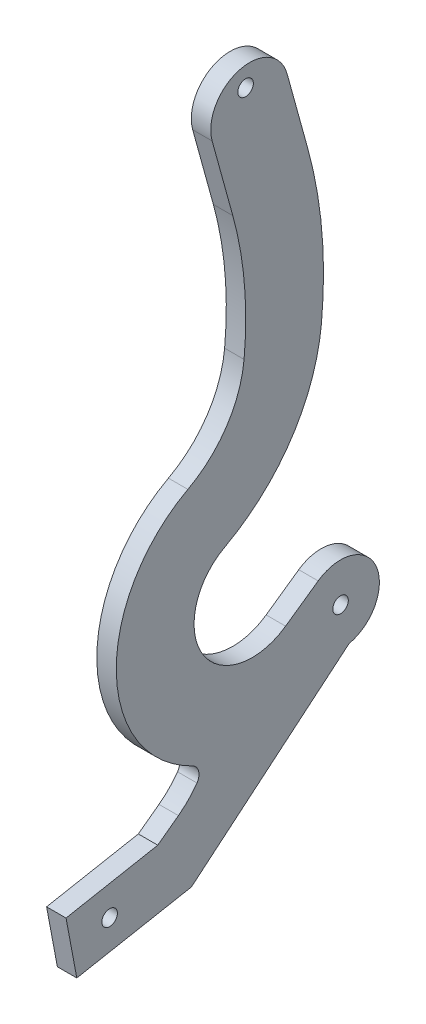
ISO-10303-21;
HEADER;
FILE_DESCRIPTION(('STEP AP214'),'2;1');
FILE_NAME('part.step','',(''),(''),'','','');
FILE_SCHEMA(('AUTOMOTIVE_DESIGN { 1 0 10303 214 1 1 1 1 }'));
ENDSEC;
DATA;
#1=APPLICATION_CONTEXT('core data for automotive mechanical design processes');
#2=APPLICATION_PROTOCOL_DEFINITION('international standard','automotive_design',2000,#1);
#3=PRODUCT_CONTEXT('',#1,'mechanical');
#4=PRODUCT('Part','Part','',(#3));
#5=PRODUCT_RELATED_PRODUCT_CATEGORY('part','',(#4));
#6=PRODUCT_DEFINITION_FORMATION('','',#4);
#7=PRODUCT_DEFINITION_CONTEXT('part definition',#1,'design');
#8=PRODUCT_DEFINITION('design','',#6,#7);
#9=PRODUCT_DEFINITION_SHAPE('','',#8);
#10=(LENGTH_UNIT() NAMED_UNIT(*) SI_UNIT(.MILLI.,.METRE.));
#11=(NAMED_UNIT(*) PLANE_ANGLE_UNIT() SI_UNIT($,.RADIAN.));
#12=(NAMED_UNIT(*) SI_UNIT($,.STERADIAN.) SOLID_ANGLE_UNIT());
#13=UNCERTAINTY_MEASURE_WITH_UNIT(LENGTH_MEASURE(1.E-05),#10,'distance_accuracy_value','');
#14=(GEOMETRIC_REPRESENTATION_CONTEXT(3) GLOBAL_UNCERTAINTY_ASSIGNED_CONTEXT((#13)) GLOBAL_UNIT_ASSIGNED_CONTEXT((#10,
#11,#12)) REPRESENTATION_CONTEXT('',''));
#15=CARTESIAN_POINT('',(0.,0.,0.));
#16=DIRECTION('',(0.,0.,1.));
#17=DIRECTION('',(1.,0.,0.));
#18=AXIS2_PLACEMENT_3D('',#15,#16,#17);
#19=CARTESIAN_POINT('',(6.35,155.517192161782,29.6872873156875));
#20=DIRECTION('',(-1.,0.,0.));
#21=DIRECTION('',(0.,0.,1.));
#22=AXIS2_PLACEMENT_3D('',#19,#20,#21);
#23=PLANE('',#22);
#24=CARTESIAN_POINT('',(6.35,161.740192161782,31.0071189591956));
#25=DIRECTION('',(1.,0.,0.));
#26=DIRECTION('',(0.,0.,-1.));
#27=AXIS2_PLACEMENT_3D('',#24,#25,#26);
#28=CIRCLE('',#27,2.54000000000002);
#29=CARTESIAN_POINT('',(6.35,161.740192161782,28.4671189591955));
#30=VERTEX_POINT('',#29);
#31=EDGE_CURVE('E51',#30,#30,#28,.T.);
#32=ORIENTED_EDGE('',*,*,#31,.F.);
#33=EDGE_LOOP('',(#32));
#34=FACE_BOUND('',#33,.T.);
#35=CARTESIAN_POINT('',(6.35,96.4492040395704,148.413015743073));
#36=DIRECTION('',(-1.,0.,0.));
#37=DIRECTION('',(0.,0.,1.));
#38=AXIS2_PLACEMENT_3D('',#35,#36,#37);
#39=CIRCLE('',#38,117.452471399576);
#40=CARTESIAN_POINT('',(6.35,127.65581082175,35.1821421660723));
#41=VERTEX_POINT('',#40);
#42=CARTESIAN_POINT('',(6.35,85.1485598709771,31.5054519191565));
#43=VERTEX_POINT('',#42);
#44=EDGE_CURVE('E94',#41,#43,#39,.T.);
#45=ORIENTED_EDGE('',*,*,#44,.T.);
#46=CARTESIAN_POINT('',(6.35,88.5305289737302,66.4926405105344));
#47=DIRECTION('',(1.,0.,0.));
#48=DIRECTION('',(0.,0.,-1.));
#49=AXIS2_PLACEMENT_3D('',#46,#47,#48);
#50=CIRCLE('',#49,35.1502643025713);
#51=CARTESIAN_POINT('',(6.35,57.5648593461637,49.8592889223241));
#52=VERTEX_POINT('',#51);
#53=EDGE_CURVE('E108',#52,#43,#50,.T.);
#54=ORIENTED_EDGE('',*,*,#53,.F.);
#55=CARTESIAN_POINT('',(6.35,18.4598877016455,28.8538738922794));
#56=DIRECTION('',(1.,0.,0.));
#57=DIRECTION('',(0.,0.,-1.));
#58=AXIS2_PLACEMENT_3D('',#55,#56,#57);
#59=CIRCLE('',#58,44.3894837535085);
#60=CARTESIAN_POINT('',(6.35,-21.574793953466,48.0280892002617));
#61=VERTEX_POINT('',#60);
#62=EDGE_CURVE('E122',#52,#61,#59,.T.);
#63=ORIENTED_EDGE('',*,*,#62,.T.);
#64=CARTESIAN_POINT('',(6.35,-24.8697292453495,50.1607095545222));
#65=DIRECTION('',(1.,0.,0.));
#66=DIRECTION('',(0.,0.,-1.));
#67=AXIS2_PLACEMENT_3D('',#64,#65,#66);
#68=CIRCLE('',#67,3.92487810678309);
#69=CARTESIAN_POINT('',(6.35,-27.00234959961,46.8657742626387));
#70=VERTEX_POINT('',#69);
#71=EDGE_CURVE('E127',#61,#70,#68,.F.);
#72=ORIENTED_EDGE('',*,*,#71,.T.);
#73=CARTESIAN_POINT('',(6.35,-10.6975357372604,69.5549048082134));
#74=DIRECTION('',(-1.,0.,0.));
#75=DIRECTION('',(0.,0.,1.));
#76=AXIS2_PLACEMENT_3D('',#73,#74,#75);
#77=CIRCLE('',#76,27.94);
#78=CARTESIAN_POINT('',(6.35,-33.1640370208868,52.9446694073285));
#79=VERTEX_POINT('',#78);
#80=EDGE_CURVE('E329',#70,#79,#77,.T.);
#81=ORIENTED_EDGE('',*,*,#80,.T.);
#82=DIRECTION('',(0.,-0.594496614204901,0.804098113229293));
#83=VECTOR('',#82,1.);
#84=CARTESIAN_POINT('',(6.35,-33.1640370208868,52.9446694073285));
#85=LINE('',#84,#83);
#86=CARTESIAN_POINT('',(6.35,-38.1558400001423,59.6964309166854));
#87=VERTEX_POINT('',#86);
#88=EDGE_CURVE('E357',#79,#87,#85,.T.);
#89=ORIENTED_EDGE('',*,*,#88,.T.);
#90=DIRECTION('',(0.,-0.184641972003783,0.982805851719735));
#91=VECTOR('',#90,1.);
#92=CARTESIAN_POINT('',(6.35,-38.1558400001423,59.6964309166854));
#93=LINE('',#92,#91);
#94=CARTESIAN_POINT('',(6.35,-43.7837273068176,89.652353277103));
#95=VERTEX_POINT('',#94);
#96=EDGE_CURVE('E361',#87,#95,#93,.T.);
#97=ORIENTED_EDGE('',*,*,#96,.T.);
#98=DIRECTION('',(0.,-0.982805851719735,-0.184641972003782));
#99=VECTOR('',#98,1.);
#100=CARTESIAN_POINT('',(6.35,-43.7837273068176,89.652353277103));
#101=LINE('',#100,#99);
#102=CARTESIAN_POINT('',(6.35,-62.5061787820785,86.1349237104309));
#103=VERTEX_POINT('',#102);
#104=EDGE_CURVE('E365',#95,#103,#101,.T.);
#105=ORIENTED_EDGE('',*,*,#104,.T.);
#106=DIRECTION('',(0.,0.184641972003782,-0.982805851719735));
#107=VECTOR('',#106,1.);
#108=CARTESIAN_POINT('',(6.35,-62.5061787820785,86.1349237104309));
#109=LINE('',#108,#107);
#110=CARTESIAN_POINT('',(6.35,-55.4713196487344,48.690020759909));
#111=VERTEX_POINT('',#110);
#112=EDGE_CURVE('E337',#103,#111,#109,.T.);
#113=ORIENTED_EDGE('',*,*,#112,.T.);
#114=DIRECTION('',(0.,0.641903083129622,-0.766785779646888));
#115=VECTOR('',#114,1.);
#116=CARTESIAN_POINT('',(6.35,-8.64960786059183,-7.24088800412151));
#117=LINE('',#116,#115);
#118=CARTESIAN_POINT('',(6.35,-12.3949253178535,-2.76691640004438));
#119=VERTEX_POINT('',#118);
#120=EDGE_CURVE('E137',#111,#119,#117,.T.);
#121=ORIENTED_EDGE('',*,*,#120,.T.);
#122=CARTESIAN_POINT('',(6.35,0.,0.));
#123=DIRECTION('',(1.,0.,0.));
#124=DIRECTION('',(0.,0.,-1.));
#125=AXIS2_PLACEMENT_3D('',#122,#123,#124);
#126=CIRCLE('',#125,12.7);
#127=CARTESIAN_POINT('',(6.35,10.3930835891263,7.29889125206247));
#128=VERTEX_POINT('',#127);
#129=EDGE_CURVE('E141',#119,#128,#126,.T.);
#130=ORIENTED_EDGE('',*,*,#129,.T.);
#131=DIRECTION('',(0.,0.574715846619092,-0.81835303851388));
#132=VECTOR('',#131,1.);
#133=CARTESIAN_POINT('',(6.35,10.3930835891263,7.29889125206247));
#134=LINE('',#133,#132);
#135=CARTESIAN_POINT('',(6.35,2.9197859721519,17.9403166600223));
#136=VERTEX_POINT('',#135);
#137=EDGE_CURVE('E145',#136,#128,#134,.T.);
#138=ORIENTED_EDGE('',*,*,#137,.F.);
#139=CARTESIAN_POINT('',(6.35,18.4598877016455,28.8538738922794));
#140=DIRECTION('',(1.,0.,0.));
#141=DIRECTION('',(0.,0.,-1.));
#142=AXIS2_PLACEMENT_3D('',#139,#140,#141);
#143=CIRCLE('',#142,18.9894837535085);
#144=CARTESIAN_POINT('',(6.35,35.1886973415255,37.8398307838643));
#145=VERTEX_POINT('',#144);
#146=EDGE_CURVE('E130',#145,#136,#143,.T.);
#147=ORIENTED_EDGE('',*,*,#146,.F.);
#148=CARTESIAN_POINT('',(6.35,88.5305289737426,66.4926405105415));
#149=DIRECTION('',(1.,0.,0.));
#150=DIRECTION('',(0.,0.,-1.));
#151=AXIS2_PLACEMENT_3D('',#148,#149,#150);
#152=CIRCLE('',#151,60.5502643025855);
#153=CARTESIAN_POINT('',(6.35,82.7047086820081,6.22329237202771));
#154=VERTEX_POINT('',#153);
#155=EDGE_CURVE('E123',#145,#154,#152,.T.);
#156=ORIENTED_EDGE('',*,*,#155,.T.);
#157=CARTESIAN_POINT('',(6.35,96.4492040395463,148.41301574316));
#158=DIRECTION('',(1.,0.,0.));
#159=DIRECTION('',(0.,0.,1.));
#160=AXIS2_PLACEMENT_3D('',#157,#158,#159);
#161=CIRCLE('',#160,142.852471399667);
#162=CARTESIAN_POINT('',(6.35,134.404479477437,10.6950951539122));
#163=VERTEX_POINT('',#162);
#164=EDGE_CURVE('E114',#154,#163,#161,.T.);
#165=ORIENTED_EDGE('',*,*,#164,.T.);
#166=DIRECTION('',(0.,0.964056968982683,0.26569561636565));
#167=VECTOR('',#166,1.);
#168=CARTESIAN_POINT('',(6.35,158.891526489625,17.4437638096074));
#169=LINE('',#168,#167);
#170=CARTESIAN_POINT('',(6.35,158.891526489625,17.4437638096074));
#171=VERTEX_POINT('',#170);
#172=EDGE_CURVE('E210',#163,#171,#169,.T.);
#173=ORIENTED_EDGE('',*,*,#172,.T.);
#174=CARTESIAN_POINT('',(6.35,155.517192161782,29.6872873156875));
#175=DIRECTION('',(1.,0.,0.));
#176=DIRECTION('',(0.,0.,1.));
#177=AXIS2_PLACEMENT_3D('',#174,#175,#176);
#178=CIRCLE('',#177,12.7);
#179=CARTESIAN_POINT('',(6.35,152.142857833938,41.9308108217675));
#180=VERTEX_POINT('',#179);
#181=EDGE_CURVE('E213',#171,#180,#178,.T.);
#182=ORIENTED_EDGE('',*,*,#181,.T.);
#183=DIRECTION('',(0.,-0.964056968982683,-0.265695616365649));
#184=VECTOR('',#183,1.);
#185=CARTESIAN_POINT('',(6.35,139.899334327844,38.5564764939199));
#186=LINE('',#185,#184);
#187=EDGE_CURVE('E111',#180,#41,#186,.T.);
#188=ORIENTED_EDGE('',*,*,#187,.T.);
#189=EDGE_LOOP('',(#45,#54,#63,#72,#81,#89,#97,#105,#113,#121,#130,#138,#147,#156,#165,#173,
#182,#188));
#190=FACE_BOUND('',#189,.T.);
#191=CARTESIAN_POINT('',(6.35,0.,0.));
#192=DIRECTION('',(1.,0.,0.));
#193=DIRECTION('',(0.,0.,-1.));
#194=AXIS2_PLACEMENT_3D('',#191,#192,#193);
#195=CIRCLE('',#194,2.54);
#196=CARTESIAN_POINT('',(6.35,0.,-2.54));
#197=VERTEX_POINT('',#196);
#198=EDGE_CURVE('E149',#197,#197,#195,.F.);
#199=ORIENTED_EDGE('',*,*,#198,.T.);
#200=EDGE_LOOP('',(#199));
#201=FACE_BOUND('',#200,.T.);
#202=CARTESIAN_POINT('',(6.35,-50.8,75.4120041769263));
#203=DIRECTION('',(1.,0.,0.));
#204=DIRECTION('',(0.,0.,-1.));
#205=AXIS2_PLACEMENT_3D('',#202,#203,#204);
#206=CIRCLE('',#205,2.54);
#207=CARTESIAN_POINT('',(6.35,-50.8,72.8720041769263));
#208=VERTEX_POINT('',#207);
#209=EDGE_CURVE('E324',#208,#208,#206,.T.);
#210=ORIENTED_EDGE('',*,*,#209,.F.);
#211=EDGE_LOOP('',(#210));
#212=FACE_BOUND('',#211,.T.);
#213=ADVANCED_FACE('F41',(#34,#190,#201,#212),#23,.F.);
#214=CARTESIAN_POINT('',(0.,155.517192161782,29.6872873156875));
#215=DIRECTION('',(-1.,0.,0.));
#216=DIRECTION('',(0.,0.,1.));
#217=AXIS2_PLACEMENT_3D('',#214,#215,#216);
#218=PLANE('',#217);
#219=CARTESIAN_POINT('',(0.,96.4492040395463,148.41301574316));
#220=DIRECTION('',(1.,0.,0.));
#221=DIRECTION('',(0.,0.,1.));
#222=AXIS2_PLACEMENT_3D('',#219,#220,#221);
#223=CIRCLE('',#222,142.852471399667);
#224=CARTESIAN_POINT('',(0.,82.704708682008,6.22329237202771));
#225=VERTEX_POINT('',#224);
#226=CARTESIAN_POINT('',(0.,134.404479477437,10.6950951539122));
#227=VERTEX_POINT('',#226);
#228=EDGE_CURVE('E187',#225,#227,#223,.T.);
#229=ORIENTED_EDGE('',*,*,#228,.F.);
#230=CARTESIAN_POINT('',(0.,88.5305289737426,66.4926405105415));
#231=DIRECTION('',(1.,0.,0.));
#232=DIRECTION('',(0.,0.,-1.));
#233=AXIS2_PLACEMENT_3D('',#230,#231,#232);
#234=CIRCLE('',#233,60.5502643025855);
#235=CARTESIAN_POINT('',(0.,35.1886973415255,37.8398307838643));
#236=VERTEX_POINT('',#235);
#237=EDGE_CURVE('E394',#236,#225,#234,.T.);
#238=ORIENTED_EDGE('',*,*,#237,.F.);
#239=CARTESIAN_POINT('',(0.,18.4598877016455,28.8538738922794));
#240=DIRECTION('',(1.,0.,0.));
#241=DIRECTION('',(0.,0.,-1.));
#242=AXIS2_PLACEMENT_3D('',#239,#240,#241);
#243=CIRCLE('',#242,18.9894837535085);
#244=CARTESIAN_POINT('',(0.,2.9197859721519,17.9403166600223));
#245=VERTEX_POINT('',#244);
#246=EDGE_CURVE('E153',#236,#245,#243,.T.);
#247=ORIENTED_EDGE('',*,*,#246,.T.);
#248=DIRECTION('',(0.,0.574715846619092,-0.81835303851388));
#249=VECTOR('',#248,1.);
#250=CARTESIAN_POINT('',(0.,10.3930835891263,7.29889125206247));
#251=LINE('',#250,#249);
#252=CARTESIAN_POINT('',(0.,10.3930835891263,7.29889125206247));
#253=VERTEX_POINT('',#252);
#254=EDGE_CURVE('E417',#245,#253,#251,.T.);
#255=ORIENTED_EDGE('',*,*,#254,.T.);
#256=CARTESIAN_POINT('',(0.,0.,0.));
#257=DIRECTION('',(1.,0.,0.));
#258=DIRECTION('',(0.,0.,-1.));
#259=AXIS2_PLACEMENT_3D('',#256,#257,#258);
#260=CIRCLE('',#259,12.7);
#261=CARTESIAN_POINT('',(0.,-12.3949253178535,-2.76691640004438));
#262=VERTEX_POINT('',#261);
#263=EDGE_CURVE('E413',#262,#253,#260,.T.);
#264=ORIENTED_EDGE('',*,*,#263,.F.);
#265=DIRECTION('',(0.,0.641903083129622,-0.766785779646888));
#266=VECTOR('',#265,1.);
#267=CARTESIAN_POINT('',(0.,-8.64960786059183,-7.24088800412151));
#268=LINE('',#267,#266);
#269=CARTESIAN_POINT('',(0.,-55.4713196487344,48.690020759909));
#270=VERTEX_POINT('',#269);
#271=EDGE_CURVE('E409',#270,#262,#268,.T.);
#272=ORIENTED_EDGE('',*,*,#271,.F.);
#273=DIRECTION('',(0.,0.184641972003782,-0.982805851719735));
#274=VECTOR('',#273,1.);
#275=CARTESIAN_POINT('',(0.,-62.5061787820785,86.1349237104309));
#276=LINE('',#275,#274);
#277=CARTESIAN_POINT('',(0.,-62.5061787820785,86.1349237104309));
#278=VERTEX_POINT('',#277);
#279=EDGE_CURVE('E349',#278,#270,#276,.T.);
#280=ORIENTED_EDGE('',*,*,#279,.F.);
#281=DIRECTION('',(0.,-0.982805851719735,-0.184641972003782));
#282=VECTOR('',#281,1.);
#283=CARTESIAN_POINT('',(0.,-43.7837273068176,89.652353277103));
#284=LINE('',#283,#282);
#285=CARTESIAN_POINT('',(0.,-43.7837273068176,89.652353277103));
#286=VERTEX_POINT('',#285);
#287=EDGE_CURVE('E345',#286,#278,#284,.T.);
#288=ORIENTED_EDGE('',*,*,#287,.F.);
#289=DIRECTION('',(0.,-0.184641972003783,0.982805851719735));
#290=VECTOR('',#289,1.);
#291=CARTESIAN_POINT('',(0.,-38.1558400001423,59.6964309166854));
#292=LINE('',#291,#290);
#293=CARTESIAN_POINT('',(0.,-38.1558400001423,59.6964309166854));
#294=VERTEX_POINT('',#293);
#295=EDGE_CURVE('E341',#294,#286,#292,.T.);
#296=ORIENTED_EDGE('',*,*,#295,.F.);
#297=DIRECTION('',(0.,-0.594496614204901,0.804098113229293));
#298=VECTOR('',#297,1.);
#299=CARTESIAN_POINT('',(0.,-33.1640370208868,52.9446694073285));
#300=LINE('',#299,#298);
#301=CARTESIAN_POINT('',(0.,-33.1640370208868,52.9446694073285));
#302=VERTEX_POINT('',#301);
#303=EDGE_CURVE('E336',#302,#294,#300,.T.);
#304=ORIENTED_EDGE('',*,*,#303,.F.);
#305=CARTESIAN_POINT('',(0.,-10.6975357372604,69.5549048082134));
#306=DIRECTION('',(-1.,0.,0.));
#307=DIRECTION('',(0.,0.,1.));
#308=AXIS2_PLACEMENT_3D('',#305,#306,#307);
#309=CIRCLE('',#308,27.94);
#310=CARTESIAN_POINT('',(0.,-27.00234959961,46.8657742626387));
#311=VERTEX_POINT('',#310);
#312=EDGE_CURVE('E332',#311,#302,#309,.T.);
#313=ORIENTED_EDGE('',*,*,#312,.F.);
#314=CARTESIAN_POINT('',(0.,-24.8697292453495,50.1607095545222));
#315=DIRECTION('',(1.,0.,0.));
#316=DIRECTION('',(0.,0.,-1.));
#317=AXIS2_PLACEMENT_3D('',#314,#315,#316);
#318=CIRCLE('',#317,3.92487810678309);
#319=CARTESIAN_POINT('',(0.,-21.574793953466,48.0280892002617));
#320=VERTEX_POINT('',#319);
#321=EDGE_CURVE('E405',#320,#311,#318,.F.);
#322=ORIENTED_EDGE('',*,*,#321,.F.);
#323=CARTESIAN_POINT('',(0.,18.4598877016455,28.8538738922794));
#324=DIRECTION('',(1.,0.,0.));
#325=DIRECTION('',(0.,0.,-1.));
#326=AXIS2_PLACEMENT_3D('',#323,#324,#325);
#327=CIRCLE('',#326,44.3894837535085);
#328=CARTESIAN_POINT('',(0.,57.5648593461637,49.8592889223241));
#329=VERTEX_POINT('',#328);
#330=EDGE_CURVE('E401',#329,#320,#327,.T.);
#331=ORIENTED_EDGE('',*,*,#330,.F.);
#332=CARTESIAN_POINT('',(0.,88.5305289737302,66.4926405105344));
#333=DIRECTION('',(1.,0.,0.));
#334=DIRECTION('',(0.,0.,-1.));
#335=AXIS2_PLACEMENT_3D('',#332,#333,#334);
#336=CIRCLE('',#335,35.1502643025713);
#337=CARTESIAN_POINT('',(0.,85.1485598709771,31.5054519191565));
#338=VERTEX_POINT('',#337);
#339=EDGE_CURVE('E398',#329,#338,#336,.T.);
#340=ORIENTED_EDGE('',*,*,#339,.T.);
#341=CARTESIAN_POINT('',(0.,96.4492040395704,148.413015743073));
#342=DIRECTION('',(-1.,0.,0.));
#343=DIRECTION('',(0.,0.,1.));
#344=AXIS2_PLACEMENT_3D('',#341,#342,#343);
#345=CIRCLE('',#344,117.452471399576);
#346=CARTESIAN_POINT('',(0.,127.65581082175,35.1821421660723));
#347=VERTEX_POINT('',#346);
#348=EDGE_CURVE('E96',#347,#338,#345,.T.);
#349=ORIENTED_EDGE('',*,*,#348,.F.);
#350=DIRECTION('',(0.,-0.964056968982683,-0.265695616365648));
#351=VECTOR('',#350,1.);
#352=CARTESIAN_POINT('',(0.,139.899334327844,38.5564764939199));
#353=LINE('',#352,#351);
#354=CARTESIAN_POINT('',(0.,152.142857833938,41.9308108217675));
#355=VERTEX_POINT('',#354);
#356=EDGE_CURVE('E184',#355,#347,#353,.T.);
#357=ORIENTED_EDGE('',*,*,#356,.F.);
#358=CARTESIAN_POINT('',(0.,155.517192161782,29.6872873156875));
#359=DIRECTION('',(1.,0.,0.));
#360=DIRECTION('',(0.,0.,1.));
#361=AXIS2_PLACEMENT_3D('',#358,#359,#360);
#362=CIRCLE('',#361,12.7);
#363=CARTESIAN_POINT('',(0.,158.891526489625,17.4437638096074));
#364=VERTEX_POINT('',#363);
#365=EDGE_CURVE('E197',#364,#355,#362,.T.);
#366=ORIENTED_EDGE('',*,*,#365,.F.);
#367=DIRECTION('',(0.,0.964056968982683,0.26569561636565));
#368=VECTOR('',#367,1.);
#369=CARTESIAN_POINT('',(0.,158.891526489625,17.4437638096074));
#370=LINE('',#369,#368);
#371=EDGE_CURVE('E192',#227,#364,#370,.T.);
#372=ORIENTED_EDGE('',*,*,#371,.F.);
#373=EDGE_LOOP('',(#229,#238,#247,#255,#264,#272,#280,#288,#296,#304,#313,#322,#331,#340,#349,
#357,#366,#372));
#374=FACE_BOUND('',#373,.T.);
#375=CARTESIAN_POINT('',(0.,161.740192161782,31.0071189591956));
#376=DIRECTION('',(1.,0.,0.));
#377=DIRECTION('',(0.,0.,-1.));
#378=AXIS2_PLACEMENT_3D('',#375,#376,#377);
#379=CIRCLE('',#378,2.54000000000002);
#380=CARTESIAN_POINT('',(0.,161.740192161782,28.4671189591955));
#381=VERTEX_POINT('',#380);
#382=EDGE_CURVE('E209',#381,#381,#379,.T.);
#383=ORIENTED_EDGE('',*,*,#382,.T.);
#384=EDGE_LOOP('',(#383));
#385=FACE_BOUND('',#384,.T.);
#386=CARTESIAN_POINT('',(0.,0.,0.));
#387=DIRECTION('',(1.,0.,0.));
#388=DIRECTION('',(0.,0.,-1.));
#389=AXIS2_PLACEMENT_3D('',#386,#387,#388);
#390=CIRCLE('',#389,2.54);
#391=CARTESIAN_POINT('',(0.,0.,-2.54));
#392=VERTEX_POINT('',#391);
#393=EDGE_CURVE('E179',#392,#392,#390,.F.);
#394=ORIENTED_EDGE('',*,*,#393,.F.);
#395=EDGE_LOOP('',(#394));
#396=FACE_BOUND('',#395,.T.);
#397=CARTESIAN_POINT('',(0.,-50.8,75.4120041769263));
#398=DIRECTION('',(1.,0.,0.));
#399=DIRECTION('',(0.,0.,-1.));
#400=AXIS2_PLACEMENT_3D('',#397,#398,#399);
#401=CIRCLE('',#400,2.54);
#402=CARTESIAN_POINT('',(0.,-50.8,72.8720041769263));
#403=VERTEX_POINT('',#402);
#404=EDGE_CURVE('E321',#403,#403,#401,.T.);
#405=ORIENTED_EDGE('',*,*,#404,.T.);
#406=EDGE_LOOP('',(#405));
#407=FACE_BOUND('',#406,.T.);
#408=ADVANCED_FACE('F231',(#374,#385,#396,#407),#218,.T.);
#409=CARTESIAN_POINT('',(6.35,155.517192161782,29.6872873156875));
#410=DIRECTION('',(-1.,0.,0.));
#411=DIRECTION('',(0.,0.,1.));
#412=AXIS2_PLACEMENT_3D('',#409,#410,#411);
#413=CYLINDRICAL_SURFACE('',#412,12.7);
#414=ORIENTED_EDGE('',*,*,#365,.T.);
#415=DIRECTION('',(-1.,0.,0.));
#416=VECTOR('',#415,1.);
#417=CARTESIAN_POINT('',(6.35,152.142857833938,41.9308108217675));
#418=LINE('',#417,#416);
#419=EDGE_CURVE('E180',#180,#355,#418,.T.);
#420=ORIENTED_EDGE('',*,*,#419,.F.);
#421=ORIENTED_EDGE('',*,*,#181,.F.);
#422=DIRECTION('',(-1.,0.,0.));
#423=VECTOR('',#422,1.);
#424=CARTESIAN_POINT('',(6.35,158.891526489625,17.4437638096074));
#425=LINE('',#424,#423);
#426=EDGE_CURVE('E193',#171,#364,#425,.T.);
#427=ORIENTED_EDGE('',*,*,#426,.T.);
#428=EDGE_LOOP('',(#414,#420,#421,#427));
#429=FACE_BOUND('',#428,.T.);
#430=ADVANCED_FACE('F235',(#429),#413,.T.);
#431=CARTESIAN_POINT('',(6.35,139.899334327844,38.5564764939199));
#432=DIRECTION('',(0.,0.265695616365648,-0.964056968982683));
#433=DIRECTION('',(0.,0.964056968982683,0.265695616365648));
#434=AXIS2_PLACEMENT_3D('',#431,#432,#433);
#435=PLANE('',#434);
#436=ORIENTED_EDGE('',*,*,#356,.T.);
#437=DIRECTION('',(-1.,0.,0.));
#438=VECTOR('',#437,1.);
#439=CARTESIAN_POINT('',(6.35,127.65581082175,35.1821421660723));
#440=LINE('',#439,#438);
#441=EDGE_CURVE('E102',#41,#347,#440,.T.);
#442=ORIENTED_EDGE('',*,*,#441,.F.);
#443=ORIENTED_EDGE('',*,*,#187,.F.);
#444=ORIENTED_EDGE('',*,*,#419,.T.);
#445=EDGE_LOOP('',(#436,#442,#443,#444));
#446=FACE_BOUND('',#445,.T.);
#447=ADVANCED_FACE('F240',(#446),#435,.F.);
#448=CARTESIAN_POINT('',(6.35,96.4492040395704,148.413015743073));
#449=DIRECTION('',(-1.,0.,0.));
#450=DIRECTION('',(0.,0.,1.));
#451=AXIS2_PLACEMENT_3D('',#448,#449,#450);
#452=CYLINDRICAL_SURFACE('',#451,117.452471399576);
#453=ORIENTED_EDGE('',*,*,#348,.T.);
#454=DIRECTION('',(1.,0.,0.));
#455=VECTOR('',#454,1.);
#456=CARTESIAN_POINT('',(0.,85.1485598709771,31.5054519191565));
#457=LINE('',#456,#455);
#458=EDGE_CURVE('E44',#338,#43,#457,.T.);
#459=ORIENTED_EDGE('',*,*,#458,.T.);
#460=ORIENTED_EDGE('',*,*,#44,.F.);
#461=ORIENTED_EDGE('',*,*,#441,.T.);
#462=EDGE_LOOP('',(#453,#459,#460,#461));
#463=FACE_BOUND('',#462,.T.);
#464=ADVANCED_FACE('F92',(#463),#452,.F.);
#465=CARTESIAN_POINT('',(6.35,96.4492040395463,148.41301574316));
#466=DIRECTION('',(-1.,0.,0.));
#467=DIRECTION('',(0.,0.,1.));
#468=AXIS2_PLACEMENT_3D('',#465,#466,#467);
#469=CYLINDRICAL_SURFACE('',#468,142.852471399667);
#470=ORIENTED_EDGE('',*,*,#164,.F.);
#471=DIRECTION('',(1.,0.,0.));
#472=VECTOR('',#471,1.);
#473=CARTESIAN_POINT('',(0.,82.704708682008,6.22329237202771));
#474=LINE('',#473,#472);
#475=EDGE_CURVE('E11',#225,#154,#474,.T.);
#476=ORIENTED_EDGE('',*,*,#475,.F.);
#477=ORIENTED_EDGE('',*,*,#228,.T.);
#478=DIRECTION('',(-1.,0.,0.));
#479=VECTOR('',#478,1.);
#480=CARTESIAN_POINT('',(6.35,134.404479477437,10.6950951539122));
#481=LINE('',#480,#479);
#482=EDGE_CURVE('E188',#163,#227,#481,.T.);
#483=ORIENTED_EDGE('',*,*,#482,.F.);
#484=EDGE_LOOP('',(#470,#476,#477,#483));
#485=FACE_BOUND('',#484,.T.);
#486=ADVANCED_FACE('F251',(#485),#469,.T.);
#487=CARTESIAN_POINT('',(6.35,158.891526489625,17.4437638096074));
#488=DIRECTION('',(0.,-0.26569561636565,0.964056968982683));
#489=DIRECTION('',(0.,-0.964056968982683,-0.26569561636565));
#490=AXIS2_PLACEMENT_3D('',#487,#488,#489);
#491=PLANE('',#490);
#492=ORIENTED_EDGE('',*,*,#371,.T.);
#493=ORIENTED_EDGE('',*,*,#426,.F.);
#494=ORIENTED_EDGE('',*,*,#172,.F.);
#495=ORIENTED_EDGE('',*,*,#482,.T.);
#496=EDGE_LOOP('',(#492,#493,#494,#495));
#497=FACE_BOUND('',#496,.T.);
#498=ADVANCED_FACE('F248',(#497),#491,.F.);
#499=CARTESIAN_POINT('',(6.35,161.740192161782,31.0071189591956));
#500=DIRECTION('',(-1.,0.,0.));
#501=DIRECTION('',(0.,0.,1.));
#502=AXIS2_PLACEMENT_3D('',#499,#500,#501);
#503=CYLINDRICAL_SURFACE('',#502,2.54000000000002);
#504=ORIENTED_EDGE('',*,*,#31,.T.);
#505=EDGE_LOOP('',(#504));
#506=FACE_BOUND('',#505,.T.);
#507=ORIENTED_EDGE('',*,*,#382,.F.);
#508=EDGE_LOOP('',(#507));
#509=FACE_BOUND('',#508,.T.);
#510=ADVANCED_FACE('F227',(#506,#509),#503,.F.);
#511=CARTESIAN_POINT('',(0.,18.4598877016455,28.8538738922794));
#512=DIRECTION('',(1.,0.,0.));
#513=DIRECTION('',(0.,0.,-1.));
#514=AXIS2_PLACEMENT_3D('',#511,#512,#513);
#515=CYLINDRICAL_SURFACE('',#514,18.9894837535085);
#516=ORIENTED_EDGE('',*,*,#146,.T.);
#517=DIRECTION('',(1.,0.,0.));
#518=VECTOR('',#517,1.);
#519=CARTESIAN_POINT('',(0.,2.9197859721519,17.9403166600223));
#520=LINE('',#519,#518);
#521=EDGE_CURVE('E115',#245,#136,#520,.T.);
#522=ORIENTED_EDGE('',*,*,#521,.F.);
#523=ORIENTED_EDGE('',*,*,#246,.F.);
#524=DIRECTION('',(1.,0.,0.));
#525=VECTOR('',#524,1.);
#526=CARTESIAN_POINT('',(0.,35.1886973415255,37.8398307838643));
#527=LINE('',#526,#525);
#528=EDGE_CURVE('E175',#236,#145,#527,.T.);
#529=ORIENTED_EDGE('',*,*,#528,.T.);
#530=EDGE_LOOP('',(#516,#522,#523,#529));
#531=FACE_BOUND('',#530,.T.);
#532=ADVANCED_FACE('F247',(#531),#515,.F.);
#533=CARTESIAN_POINT('',(0.,10.3930835891263,7.29889125206247));
#534=DIRECTION('',(0.,-0.81835303851388,-0.574715846619092));
#535=DIRECTION('',(0.,0.574715846619092,-0.81835303851388));
#536=AXIS2_PLACEMENT_3D('',#533,#534,#535);
#537=PLANE('',#536);
#538=ORIENTED_EDGE('',*,*,#137,.T.);
#539=DIRECTION('',(1.,0.,0.));
#540=VECTOR('',#539,1.);
#541=CARTESIAN_POINT('',(0.,10.3930835891263,7.29889125206247));
#542=LINE('',#541,#540);
#543=EDGE_CURVE('E157',#253,#128,#542,.T.);
#544=ORIENTED_EDGE('',*,*,#543,.F.);
#545=ORIENTED_EDGE('',*,*,#254,.F.);
#546=ORIENTED_EDGE('',*,*,#521,.T.);
#547=EDGE_LOOP('',(#538,#544,#545,#546));
#548=FACE_BOUND('',#547,.T.);
#549=ADVANCED_FACE('F262',(#548),#537,.F.);
#550=CARTESIAN_POINT('',(0.,0.,0.));
#551=DIRECTION('',(1.,0.,0.));
#552=DIRECTION('',(0.,0.,-1.));
#553=AXIS2_PLACEMENT_3D('',#550,#551,#552);
#554=CYLINDRICAL_SURFACE('',#553,12.7);
#555=ORIENTED_EDGE('',*,*,#129,.F.);
#556=DIRECTION('',(1.,0.,0.));
#557=VECTOR('',#556,1.);
#558=CARTESIAN_POINT('',(0.,-12.3949253178535,-2.76691640004438));
#559=LINE('',#558,#557);
#560=EDGE_CURVE('E161',#262,#119,#559,.T.);
#561=ORIENTED_EDGE('',*,*,#560,.F.);
#562=ORIENTED_EDGE('',*,*,#263,.T.);
#563=ORIENTED_EDGE('',*,*,#543,.T.);
#564=EDGE_LOOP('',(#555,#561,#562,#563));
#565=FACE_BOUND('',#564,.T.);
#566=ADVANCED_FACE('F282',(#565),#554,.T.);
#567=CARTESIAN_POINT('',(0.,-8.64960786059183,-7.24088800412151));
#568=DIRECTION('',(0.,-0.766785779646888,-0.641903083129622));
#569=DIRECTION('',(0.,0.641903083129622,-0.766785779646888));
#570=AXIS2_PLACEMENT_3D('',#567,#568,#569);
#571=PLANE('',#570);
#572=ORIENTED_EDGE('',*,*,#120,.F.);
#573=DIRECTION('',(1.,0.,0.));
#574=VECTOR('',#573,1.);
#575=CARTESIAN_POINT('',(0.,-55.4713196487344,48.690020759909));
#576=LINE('',#575,#574);
#577=EDGE_CURVE('E372',#270,#111,#576,.T.);
#578=ORIENTED_EDGE('',*,*,#577,.F.);
#579=ORIENTED_EDGE('',*,*,#271,.T.);
#580=ORIENTED_EDGE('',*,*,#560,.T.);
#581=EDGE_LOOP('',(#572,#578,#579,#580));
#582=FACE_BOUND('',#581,.T.);
#583=ADVANCED_FACE('F278',(#582),#571,.T.);
#584=CARTESIAN_POINT('',(0.,-24.8697292453495,50.1607095545222));
#585=DIRECTION('',(1.,0.,0.));
#586=DIRECTION('',(0.,0.,-1.));
#587=AXIS2_PLACEMENT_3D('',#584,#585,#586);
#588=CYLINDRICAL_SURFACE('',#587,3.92487810678309);
#589=ORIENTED_EDGE('',*,*,#71,.F.);
#590=DIRECTION('',(1.,0.,0.));
#591=VECTOR('',#590,1.);
#592=CARTESIAN_POINT('',(0.,-21.574793953466,48.0280892002617));
#593=LINE('',#592,#591);
#594=EDGE_CURVE('E169',#320,#61,#593,.T.);
#595=ORIENTED_EDGE('',*,*,#594,.F.);
#596=ORIENTED_EDGE('',*,*,#321,.T.);
#597=DIRECTION('',(1.,0.,0.));
#598=VECTOR('',#597,1.);
#599=CARTESIAN_POINT('',(0.,-27.00234959961,46.8657742626387));
#600=LINE('',#599,#598);
#601=EDGE_CURVE('E165',#311,#70,#600,.T.);
#602=ORIENTED_EDGE('',*,*,#601,.T.);
#603=EDGE_LOOP('',(#589,#595,#596,#602));
#604=FACE_BOUND('',#603,.T.);
#605=ADVANCED_FACE('F274',(#604),#588,.F.);
#606=CARTESIAN_POINT('',(0.,18.4598877016455,28.8538738922794));
#607=DIRECTION('',(1.,0.,0.));
#608=DIRECTION('',(0.,0.,-1.));
#609=AXIS2_PLACEMENT_3D('',#606,#607,#608);
#610=CYLINDRICAL_SURFACE('',#609,44.3894837535085);
#611=ORIENTED_EDGE('',*,*,#62,.F.);
#612=DIRECTION('',(1.,0.,0.));
#613=VECTOR('',#612,1.);
#614=CARTESIAN_POINT('',(0.,57.5648593461637,49.8592889223241));
#615=LINE('',#614,#613);
#616=EDGE_CURVE('E120',#329,#52,#615,.T.);
#617=ORIENTED_EDGE('',*,*,#616,.F.);
#618=ORIENTED_EDGE('',*,*,#330,.T.);
#619=ORIENTED_EDGE('',*,*,#594,.T.);
#620=EDGE_LOOP('',(#611,#617,#618,#619));
#621=FACE_BOUND('',#620,.T.);
#622=ADVANCED_FACE('F271',(#621),#610,.T.);
#623=CARTESIAN_POINT('',(0.,88.5305289737302,66.4926405105344));
#624=DIRECTION('',(1.,0.,0.));
#625=DIRECTION('',(0.,0.,-1.));
#626=AXIS2_PLACEMENT_3D('',#623,#624,#625);
#627=CYLINDRICAL_SURFACE('',#626,35.1502643025713);
#628=ORIENTED_EDGE('',*,*,#53,.T.);
#629=ORIENTED_EDGE('',*,*,#458,.F.);
#630=ORIENTED_EDGE('',*,*,#339,.F.);
#631=ORIENTED_EDGE('',*,*,#616,.T.);
#632=EDGE_LOOP('',(#628,#629,#630,#631));
#633=FACE_BOUND('',#632,.T.);
#634=ADVANCED_FACE('F118',(#633),#627,.F.);
#635=CARTESIAN_POINT('',(0.,88.5305289737426,66.4926405105415));
#636=DIRECTION('',(1.,0.,0.));
#637=DIRECTION('',(0.,0.,-1.));
#638=AXIS2_PLACEMENT_3D('',#635,#636,#637);
#639=CYLINDRICAL_SURFACE('',#638,60.5502643025855);
#640=ORIENTED_EDGE('',*,*,#155,.F.);
#641=ORIENTED_EDGE('',*,*,#528,.F.);
#642=ORIENTED_EDGE('',*,*,#237,.T.);
#643=ORIENTED_EDGE('',*,*,#475,.T.);
#644=EDGE_LOOP('',(#640,#641,#642,#643));
#645=FACE_BOUND('',#644,.T.);
#646=ADVANCED_FACE('F264',(#645),#639,.T.);
#647=CARTESIAN_POINT('',(0.,0.,0.));
#648=DIRECTION('',(1.,0.,0.));
#649=DIRECTION('',(0.,0.,-1.));
#650=AXIS2_PLACEMENT_3D('',#647,#648,#649);
#651=CYLINDRICAL_SURFACE('',#650,2.54);
#652=ORIENTED_EDGE('',*,*,#393,.T.);
#653=EDGE_LOOP('',(#652));
#654=FACE_BOUND('',#653,.T.);
#655=ORIENTED_EDGE('',*,*,#198,.F.);
#656=EDGE_LOOP('',(#655));
#657=FACE_BOUND('',#656,.T.);
#658=ADVANCED_FACE('F267',(#654,#657),#651,.F.);
#659=CARTESIAN_POINT('',(0.,-50.8,75.4120041769263));
#660=DIRECTION('',(1.,0.,0.));
#661=DIRECTION('',(0.,0.,-1.));
#662=AXIS2_PLACEMENT_3D('',#659,#660,#661);
#663=CYLINDRICAL_SURFACE('',#662,2.54);
#664=ORIENTED_EDGE('',*,*,#404,.F.);
#665=EDGE_LOOP('',(#664));
#666=FACE_BOUND('',#665,.T.);
#667=ORIENTED_EDGE('',*,*,#209,.T.);
#668=EDGE_LOOP('',(#667));
#669=FACE_BOUND('',#668,.T.);
#670=ADVANCED_FACE('F292',(#666,#669),#663,.F.);
#671=CARTESIAN_POINT('',(0.,-38.1558400001423,59.6964309166854));
#672=DIRECTION('',(0.,0.982805851719735,0.184641972003783));
#673=DIRECTION('',(0.,-0.184641972003783,0.982805851719735));
#674=AXIS2_PLACEMENT_3D('',#671,#672,#673);
#675=PLANE('',#674);
#676=ORIENTED_EDGE('',*,*,#96,.F.);
#677=DIRECTION('',(1.,0.,0.));
#678=VECTOR('',#677,1.);
#679=CARTESIAN_POINT('',(0.,-38.1558400001423,59.6964309166854));
#680=LINE('',#679,#678);
#681=EDGE_CURVE('E384',#294,#87,#680,.T.);
#682=ORIENTED_EDGE('',*,*,#681,.F.);
#683=ORIENTED_EDGE('',*,*,#295,.T.);
#684=DIRECTION('',(1.,0.,0.));
#685=VECTOR('',#684,1.);
#686=CARTESIAN_POINT('',(0.,-43.7837273068176,89.652353277103));
#687=LINE('',#686,#685);
#688=EDGE_CURVE('E380',#286,#95,#687,.T.);
#689=ORIENTED_EDGE('',*,*,#688,.T.);
#690=EDGE_LOOP('',(#676,#682,#683,#689));
#691=FACE_BOUND('',#690,.T.);
#692=ADVANCED_FACE('F303',(#691),#675,.T.);
#693=CARTESIAN_POINT('',(0.,-43.7837273068176,89.652353277103));
#694=DIRECTION('',(0.,-0.184641972003782,0.982805851719735));
#695=DIRECTION('',(0.,-0.982805851719736,-0.184641972003782));
#696=AXIS2_PLACEMENT_3D('',#693,#694,#695);
#697=PLANE('',#696);
#698=ORIENTED_EDGE('',*,*,#104,.F.);
#699=ORIENTED_EDGE('',*,*,#688,.F.);
#700=ORIENTED_EDGE('',*,*,#287,.T.);
#701=DIRECTION('',(1.,0.,0.));
#702=VECTOR('',#701,1.);
#703=CARTESIAN_POINT('',(0.,-62.5061787820785,86.1349237104309));
#704=LINE('',#703,#702);
#705=EDGE_CURVE('E376',#278,#103,#704,.T.);
#706=ORIENTED_EDGE('',*,*,#705,.T.);
#707=EDGE_LOOP('',(#698,#699,#700,#706));
#708=FACE_BOUND('',#707,.T.);
#709=ADVANCED_FACE('F306',(#708),#697,.T.);
#710=CARTESIAN_POINT('',(0.,-62.5061787820785,86.1349237104309));
#711=DIRECTION('',(0.,-0.982805851719735,-0.184641972003782));
#712=DIRECTION('',(0.,0.184641972003782,-0.982805851719735));
#713=AXIS2_PLACEMENT_3D('',#710,#711,#712);
#714=PLANE('',#713);
#715=ORIENTED_EDGE('',*,*,#112,.F.);
#716=ORIENTED_EDGE('',*,*,#705,.F.);
#717=ORIENTED_EDGE('',*,*,#279,.T.);
#718=ORIENTED_EDGE('',*,*,#577,.T.);
#719=EDGE_LOOP('',(#715,#716,#717,#718));
#720=FACE_BOUND('',#719,.T.);
#721=ADVANCED_FACE('F301',(#720),#714,.T.);
#722=CARTESIAN_POINT('',(0.,-33.1640370208868,52.9446694073285));
#723=DIRECTION('',(0.,0.804098113229293,0.594496614204901));
#724=DIRECTION('',(0.,-0.594496614204901,0.804098113229293));
#725=AXIS2_PLACEMENT_3D('',#722,#723,#724);
#726=PLANE('',#725);
#727=ORIENTED_EDGE('',*,*,#88,.F.);
#728=DIRECTION('',(1.,0.,0.));
#729=VECTOR('',#728,1.);
#730=CARTESIAN_POINT('',(0.,-33.1640370208868,52.9446694073285));
#731=LINE('',#730,#729);
#732=EDGE_CURVE('E353',#302,#79,#731,.T.);
#733=ORIENTED_EDGE('',*,*,#732,.F.);
#734=ORIENTED_EDGE('',*,*,#303,.T.);
#735=ORIENTED_EDGE('',*,*,#681,.T.);
#736=EDGE_LOOP('',(#727,#733,#734,#735));
#737=FACE_BOUND('',#736,.T.);
#738=ADVANCED_FACE('F297',(#737),#726,.T.);
#739=CARTESIAN_POINT('',(0.,-10.6975357372604,69.5549048082134));
#740=DIRECTION('',(1.,0.,0.));
#741=DIRECTION('',(0.,0.,-1.));
#742=AXIS2_PLACEMENT_3D('',#739,#740,#741);
#743=CYLINDRICAL_SURFACE('',#742,27.94);
#744=ORIENTED_EDGE('',*,*,#601,.F.);
#745=ORIENTED_EDGE('',*,*,#312,.T.);
#746=ORIENTED_EDGE('',*,*,#732,.T.);
#747=ORIENTED_EDGE('',*,*,#80,.F.);
#748=EDGE_LOOP('',(#744,#745,#746,#747));
#749=FACE_BOUND('',#748,.T.);
#750=ADVANCED_FACE('F294',(#749),#743,.F.);
#751=CLOSED_SHELL('',(#213,#408,#430,#447,#464,#486,#498,#510,#532,#549,#566,#583,#605,#622,
#634,#646,#658,#670,#692,#709,#721,#738,#750));
#752=MANIFOLD_SOLID_BREP('B2',#751);
#753=ADVANCED_BREP_SHAPE_REPRESENTATION('',(#18,#752),#14);
#754=SHAPE_DEFINITION_REPRESENTATION(#9,#753);
ENDSEC;
END-ISO-10303-21;
